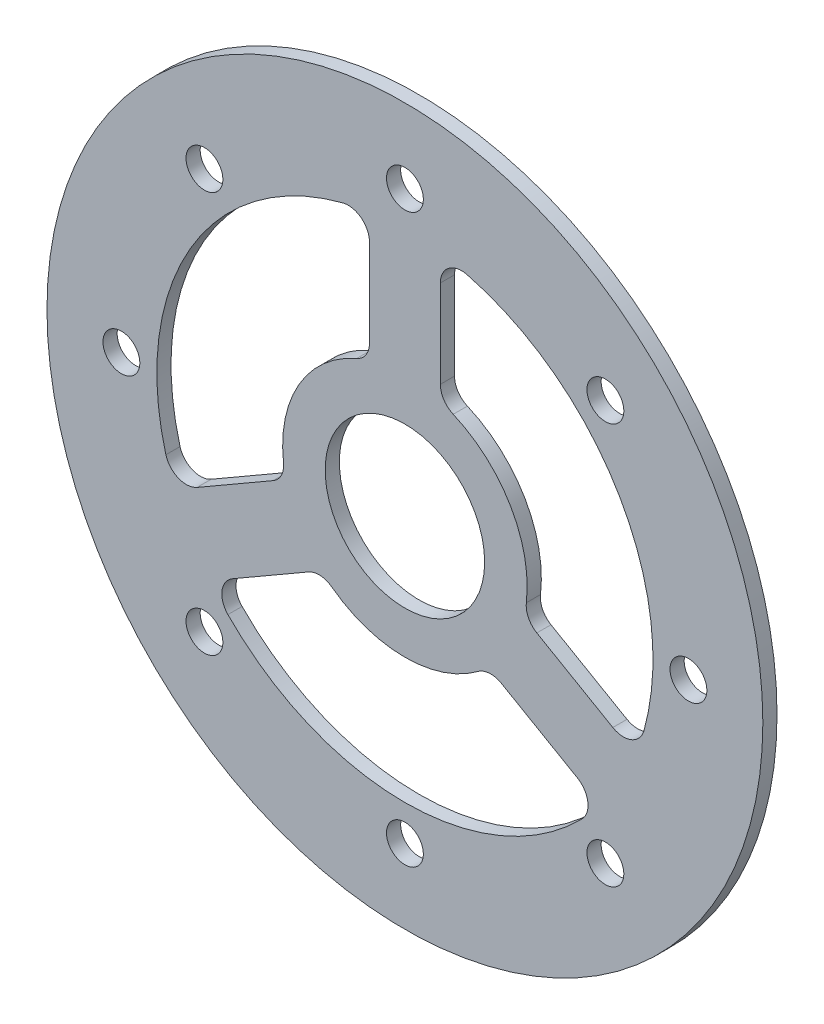
ISO-10303-21;
HEADER;
FILE_DESCRIPTION(('STEP AP214'),'2;1');
FILE_NAME('part.step','',(''),(''),'','','');
FILE_SCHEMA(('AUTOMOTIVE_DESIGN { 1 0 10303 214 1 1 1 1 }'));
ENDSEC;
DATA;
#1=APPLICATION_CONTEXT('core data for automotive mechanical design processes');
#2=APPLICATION_PROTOCOL_DEFINITION('international standard','automotive_design',2000,#1);
#3=PRODUCT_CONTEXT('',#1,'mechanical');
#4=PRODUCT('Part','Part','',(#3));
#5=PRODUCT_RELATED_PRODUCT_CATEGORY('part','',(#4));
#6=PRODUCT_DEFINITION_FORMATION('','',#4);
#7=PRODUCT_DEFINITION_CONTEXT('part definition',#1,'design');
#8=PRODUCT_DEFINITION('design','',#6,#7);
#9=PRODUCT_DEFINITION_SHAPE('','',#8);
#10=(LENGTH_UNIT() NAMED_UNIT(*) SI_UNIT(.MILLI.,.METRE.));
#11=(NAMED_UNIT(*) PLANE_ANGLE_UNIT() SI_UNIT($,.RADIAN.));
#12=(NAMED_UNIT(*) SI_UNIT($,.STERADIAN.) SOLID_ANGLE_UNIT());
#13=UNCERTAINTY_MEASURE_WITH_UNIT(LENGTH_MEASURE(1.E-05),#10,'distance_accuracy_value','');
#14=(GEOMETRIC_REPRESENTATION_CONTEXT(3) GLOBAL_UNCERTAINTY_ASSIGNED_CONTEXT((#13)) GLOBAL_UNIT_ASSIGNED_CONTEXT((#10,
#11,#12)) REPRESENTATION_CONTEXT('',''));
#15=CARTESIAN_POINT('',(0.,0.,0.));
#16=DIRECTION('',(0.,0.,1.));
#17=DIRECTION('',(1.,0.,0.));
#18=AXIS2_PLACEMENT_3D('',#15,#16,#17);
#19=CARTESIAN_POINT('',(0.,0.,2.));
#20=DIRECTION('',(0.,0.,-1.));
#21=DIRECTION('',(-1.,0.,0.));
#22=AXIS2_PLACEMENT_3D('',#19,#20,#21);
#23=CYLINDRICAL_SURFACE('',#22,35.);
#24=CARTESIAN_POINT('',(0.,0.,2.));
#25=DIRECTION('',(0.,0.,1.));
#26=DIRECTION('',(1.,0.,0.));
#27=AXIS2_PLACEMENT_3D('',#24,#25,#26);
#28=CIRCLE('',#27,35.);
#29=CARTESIAN_POINT('',(-8.75,33.8886042793149,2.));
#30=VERTEX_POINT('',#29);
#31=CARTESIAN_POINT('',(-33.7233922046847,-9.36657985654372,2.));
#32=VERTEX_POINT('',#31);
#33=EDGE_CURVE('E229',#30,#32,#28,.T.);
#34=ORIENTED_EDGE('',*,*,#33,.T.);
#35=DIRECTION('',(0.,0.,-1.));
#36=VECTOR('',#35,1.);
#37=CARTESIAN_POINT('',(-33.7233922046847,-9.36657985654372,2.));
#38=LINE('',#37,#36);
#39=CARTESIAN_POINT('',(-33.7233922046847,-9.36657985654372,0.));
#40=VERTEX_POINT('',#39);
#41=EDGE_CURVE('E52',#32,#40,#38,.T.);
#42=ORIENTED_EDGE('',*,*,#41,.T.);
#43=CARTESIAN_POINT('',(0.,0.,0.));
#44=DIRECTION('',(0.,0.,1.));
#45=DIRECTION('',(1.,0.,0.));
#46=AXIS2_PLACEMENT_3D('',#43,#44,#45);
#47=CIRCLE('',#46,35.);
#48=CARTESIAN_POINT('',(-8.75,33.8886042793149,0.));
#49=VERTEX_POINT('',#48);
#50=EDGE_CURVE('E227',#49,#40,#47,.T.);
#51=ORIENTED_EDGE('',*,*,#50,.F.);
#52=DIRECTION('',(0.,0.,-1.));
#53=VECTOR('',#52,1.);
#54=CARTESIAN_POINT('',(-8.75,33.8886042793149,2.));
#55=LINE('',#54,#53);
#56=EDGE_CURVE('E300',#49,#30,#55,.F.);
#57=ORIENTED_EDGE('',*,*,#56,.T.);
#58=EDGE_LOOP('',(#34,#42,#51,#57));
#59=FACE_BOUND('',#58,.T.);
#60=ADVANCED_FACE('F37',(#59),#23,.F.);
#61=CARTESIAN_POINT('',(-24.9733922046847,-24.5220244227713,2.));
#62=VERTEX_POINT('',#61);
#63=CARTESIAN_POINT('',(24.9733922046848,-24.5220244227713,2.));
#64=VERTEX_POINT('',#63);
#65=EDGE_CURVE('E226',#62,#64,#28,.T.);
#66=ORIENTED_EDGE('',*,*,#65,.T.);
#67=DIRECTION('',(0.,0.,-1.));
#68=VECTOR('',#67,1.);
#69=CARTESIAN_POINT('',(24.9733922046848,-24.5220244227713,2.));
#70=LINE('',#69,#68);
#71=CARTESIAN_POINT('',(24.9733922046848,-24.5220244227713,0.));
#72=VERTEX_POINT('',#71);
#73=EDGE_CURVE('E283',#64,#72,#70,.T.);
#74=ORIENTED_EDGE('',*,*,#73,.T.);
#75=CARTESIAN_POINT('',(-24.9733922046847,-24.5220244227713,0.));
#76=VERTEX_POINT('',#75);
#77=EDGE_CURVE('E231',#76,#72,#47,.T.);
#78=ORIENTED_EDGE('',*,*,#77,.F.);
#79=DIRECTION('',(0.,0.,-1.));
#80=VECTOR('',#79,1.);
#81=CARTESIAN_POINT('',(-24.9733922046847,-24.5220244227713,2.));
#82=LINE('',#81,#80);
#83=EDGE_CURVE('E280',#76,#62,#82,.F.);
#84=ORIENTED_EDGE('',*,*,#83,.T.);
#85=EDGE_LOOP('',(#66,#74,#78,#84));
#86=FACE_BOUND('',#85,.T.);
#87=ADVANCED_FACE('F368',(#86),#23,.F.);
#88=CARTESIAN_POINT('',(33.7233922046847,-9.36657985654361,0.));
#89=VERTEX_POINT('',#88);
#90=CARTESIAN_POINT('',(8.74999999999999,33.8886042793149,0.));
#91=VERTEX_POINT('',#90);
#92=EDGE_CURVE('E218',#89,#91,#47,.T.);
#93=ORIENTED_EDGE('',*,*,#92,.F.);
#94=DIRECTION('',(0.,0.,-1.));
#95=VECTOR('',#94,1.);
#96=CARTESIAN_POINT('',(33.7233922046847,-9.36657985654361,2.));
#97=LINE('',#96,#95);
#98=CARTESIAN_POINT('',(33.7233922046847,-9.36657985654361,2.));
#99=VERTEX_POINT('',#98);
#100=EDGE_CURVE('E203',#89,#99,#97,.F.);
#101=ORIENTED_EDGE('',*,*,#100,.T.);
#102=CARTESIAN_POINT('',(8.74999999999999,33.8886042793149,2.));
#103=VERTEX_POINT('',#102);
#104=EDGE_CURVE('E215',#99,#103,#28,.T.);
#105=ORIENTED_EDGE('',*,*,#104,.T.);
#106=DIRECTION('',(0.,0.,-1.));
#107=VECTOR('',#106,1.);
#108=CARTESIAN_POINT('',(8.74999999999999,33.8886042793149,2.));
#109=LINE('',#108,#107);
#110=EDGE_CURVE('E220',#103,#91,#109,.T.);
#111=ORIENTED_EDGE('',*,*,#110,.T.);
#112=EDGE_LOOP('',(#93,#101,#105,#111));
#113=FACE_BOUND('',#112,.T.);
#114=ADVANCED_FACE('F214',(#113),#23,.F.);
#115=CARTESIAN_POINT('',(0.,0.,2.));
#116=DIRECTION('',(0.,0.,1.));
#117=DIRECTION('',(1.,0.,0.));
#118=AXIS2_PLACEMENT_3D('',#115,#116,#117);
#119=PLANE('',#118);
#120=ORIENTED_EDGE('',*,*,#33,.F.);
#121=CARTESIAN_POINT('',(-8.,30.9838667696593,2.));
#122=DIRECTION('',(0.,0.,1.));
#123=DIRECTION('',(1.,0.,0.));
#124=AXIS2_PLACEMENT_3D('',#121,#122,#123);
#125=CIRCLE('',#124,3.);
#126=CARTESIAN_POINT('',(-5.,30.9838667696593,2.));
#127=VERTEX_POINT('',#126);
#128=EDGE_CURVE('E339',#30,#127,#125,.F.);
#129=ORIENTED_EDGE('',*,*,#128,.T.);
#130=DIRECTION('',(0.,-1.,0.));
#131=VECTOR('',#130,1.);
#132=CARTESIAN_POINT('',(-4.99999999999999,0.,2.));
#133=LINE('',#132,#131);
#134=CARTESIAN_POINT('',(-5.,18.6027551722856,2.));
#135=VERTEX_POINT('',#134);
#136=EDGE_CURVE('E438',#127,#135,#133,.T.);
#137=ORIENTED_EDGE('',*,*,#136,.T.);
#138=CARTESIAN_POINT('',(-8.,18.6027551722856,2.));
#139=DIRECTION('',(0.,0.,1.));
#140=DIRECTION('',(1.,0.,0.));
#141=AXIS2_PLACEMENT_3D('',#138,#139,#140);
#142=CIRCLE('',#141,3.);
#143=CARTESIAN_POINT('',(-6.81481481481481,15.8467914430581,2.));
#144=VERTEX_POINT('',#143);
#145=EDGE_CURVE('E327',#135,#144,#142,.F.);
#146=ORIENTED_EDGE('',*,*,#145,.T.);
#147=CARTESIAN_POINT('',(0.,0.,2.));
#148=DIRECTION('',(0.,0.,1.));
#149=DIRECTION('',(1.,0.,0.));
#150=AXIS2_PLACEMENT_3D('',#147,#148,#149);
#151=CIRCLE('',#150,17.25);
#152=CARTESIAN_POINT('',(-17.1311313655696,-2.02159296981291,2.));
#153=VERTEX_POINT('',#152);
#154=EDGE_CURVE('E435',#144,#153,#151,.T.);
#155=ORIENTED_EDGE('',*,*,#154,.T.);
#156=CARTESIAN_POINT('',(-20.1104585595817,-2.37317435586732,2.));
#157=DIRECTION('',(0.,0.,1.));
#158=DIRECTION('',(1.,0.,0.));
#159=AXIS2_PLACEMENT_3D('',#156,#157,#158);
#160=CIRCLE('',#159,3.);
#161=CARTESIAN_POINT('',(-18.6104585595817,-4.97125056722064,2.));
#162=VERTEX_POINT('',#161);
#163=EDGE_CURVE('E331',#153,#162,#160,.F.);
#164=ORIENTED_EDGE('',*,*,#163,.T.);
#165=DIRECTION('',(0.866025403784435,0.500000000000006,0.));
#166=VECTOR('',#165,1.);
#167=CARTESIAN_POINT('',(-2.50000000000008,4.33012701892227,2.));
#168=LINE('',#167,#166);
#169=CARTESIAN_POINT('',(-29.3328157299975,-11.1618063659076,2.));
#170=VERTEX_POINT('',#169);
#171=EDGE_CURVE('E356',#170,#162,#168,.T.);
#172=ORIENTED_EDGE('',*,*,#171,.F.);
#173=CARTESIAN_POINT('',(-30.8328157299975,-8.56373015455426,2.));
#174=DIRECTION('',(0.,0.,1.));
#175=DIRECTION('',(1.,0.,0.));
#176=AXIS2_PLACEMENT_3D('',#173,#174,#175);
#177=CIRCLE('',#176,3.);
#178=EDGE_CURVE('E335',#170,#32,#177,.F.);
#179=ORIENTED_EDGE('',*,*,#178,.T.);
#180=EDGE_LOOP('',(#120,#129,#137,#146,#155,#164,#172,#179));
#181=FACE_BOUND('',#180,.T.);
#182=DIRECTION('',(0.,-1.,0.));
#183=VECTOR('',#182,1.);
#184=CARTESIAN_POINT('',(5.00000000000002,0.,2.));
#185=LINE('',#184,#183);
#186=CARTESIAN_POINT('',(4.99999999999999,30.9838667696593,2.));
#187=VERTEX_POINT('',#186);
#188=CARTESIAN_POINT('',(5.,18.6027551722856,2.));
#189=VERTEX_POINT('',#188);
#190=EDGE_CURVE('E424',#187,#189,#185,.T.);
#191=ORIENTED_EDGE('',*,*,#190,.F.);
#192=CARTESIAN_POINT('',(7.99999999999999,30.9838667696593,2.));
#193=DIRECTION('',(0.,0.,1.));
#194=DIRECTION('',(1.,0.,0.));
#195=AXIS2_PLACEMENT_3D('',#192,#193,#194);
#196=CIRCLE('',#195,3.);
#197=EDGE_CURVE('E225',#187,#103,#196,.F.);
#198=ORIENTED_EDGE('',*,*,#197,.T.);
#199=ORIENTED_EDGE('',*,*,#104,.F.);
#200=CARTESIAN_POINT('',(30.8328157299975,-8.56373015455415,2.));
#201=DIRECTION('',(0.,0.,1.));
#202=DIRECTION('',(1.,0.,0.));
#203=AXIS2_PLACEMENT_3D('',#200,#201,#202);
#204=CIRCLE('',#203,3.);
#205=CARTESIAN_POINT('',(29.3328157299975,-11.1618063659075,2.));
#206=VERTEX_POINT('',#205);
#207=EDGE_CURVE('E199',#99,#206,#204,.F.);
#208=ORIENTED_EDGE('',*,*,#207,.T.);
#209=DIRECTION('',(-0.866025403784439,0.5,0.));
#210=VECTOR('',#209,1.);
#211=CARTESIAN_POINT('',(2.5,4.33012701892219,2.));
#212=LINE('',#211,#210);
#213=CARTESIAN_POINT('',(18.6104585595817,-4.97125056722062,2.));
#214=VERTEX_POINT('',#213);
#215=EDGE_CURVE('E428',#206,#214,#212,.T.);
#216=ORIENTED_EDGE('',*,*,#215,.T.);
#217=CARTESIAN_POINT('',(20.1104585595817,-2.3731743558673,2.));
#218=DIRECTION('',(0.,0.,1.));
#219=DIRECTION('',(1.,0.,0.));
#220=AXIS2_PLACEMENT_3D('',#217,#218,#219);
#221=CIRCLE('',#220,3.);
#222=CARTESIAN_POINT('',(17.1311313655696,-2.02159296981289,2.));
#223=VERTEX_POINT('',#222);
#224=EDGE_CURVE('E304',#214,#223,#221,.F.);
#225=ORIENTED_EDGE('',*,*,#224,.T.);
#226=CARTESIAN_POINT('',(6.81481481481481,15.8467914430581,2.));
#227=VERTEX_POINT('',#226);
#228=EDGE_CURVE('E427',#223,#227,#151,.T.);
#229=ORIENTED_EDGE('',*,*,#228,.T.);
#230=CARTESIAN_POINT('',(8.,18.6027551722856,2.));
#231=DIRECTION('',(0.,0.,1.));
#232=DIRECTION('',(1.,0.,0.));
#233=AXIS2_PLACEMENT_3D('',#230,#231,#232);
#234=CIRCLE('',#233,3.);
#235=EDGE_CURVE('E308',#227,#189,#234,.F.);
#236=ORIENTED_EDGE('',*,*,#235,.T.);
#237=EDGE_LOOP('',(#191,#198,#199,#208,#216,#225,#229,#236));
#238=FACE_BOUND('',#237,.T.);
#239=CARTESIAN_POINT('',(-40.,0.,2.));
#240=DIRECTION('',(0.,0.,1.));
#241=DIRECTION('',(1.,0.,0.));
#242=AXIS2_PLACEMENT_3D('',#239,#240,#241);
#243=CIRCLE('',#242,2.59999999999999);
#244=CARTESIAN_POINT('',(-37.4,0.,2.));
#245=VERTEX_POINT('',#244);
#246=EDGE_CURVE('E402',#245,#245,#243,.T.);
#247=ORIENTED_EDGE('',*,*,#246,.F.);
#248=EDGE_LOOP('',(#247));
#249=FACE_BOUND('',#248,.T.);
#250=CARTESIAN_POINT('',(0.,-40.,2.));
#251=DIRECTION('',(0.,0.,1.));
#252=DIRECTION('',(1.,0.,0.));
#253=AXIS2_PLACEMENT_3D('',#250,#251,#252);
#254=CIRCLE('',#253,2.59999999999999);
#255=CARTESIAN_POINT('',(2.6,-40.,2.));
#256=VERTEX_POINT('',#255);
#257=EDGE_CURVE('E390',#256,#256,#254,.T.);
#258=ORIENTED_EDGE('',*,*,#257,.F.);
#259=EDGE_LOOP('',(#258));
#260=FACE_BOUND('',#259,.T.);
#261=CARTESIAN_POINT('',(40.,0.,2.));
#262=DIRECTION('',(0.,0.,1.));
#263=DIRECTION('',(1.,0.,0.));
#264=AXIS2_PLACEMENT_3D('',#261,#262,#263);
#265=CIRCLE('',#264,2.59999999999999);
#266=CARTESIAN_POINT('',(42.6,0.,2.));
#267=VERTEX_POINT('',#266);
#268=EDGE_CURVE('E379',#267,#267,#265,.T.);
#269=ORIENTED_EDGE('',*,*,#268,.F.);
#270=EDGE_LOOP('',(#269));
#271=FACE_BOUND('',#270,.T.);
#272=ORIENTED_EDGE('',*,*,#65,.F.);
#273=CARTESIAN_POINT('',(-22.8328157299975,-22.4201366151052,2.));
#274=DIRECTION('',(0.,0.,1.));
#275=DIRECTION('',(1.,0.,0.));
#276=AXIS2_PLACEMENT_3D('',#273,#274,#275);
#277=CIRCLE('',#276,3.);
#278=CARTESIAN_POINT('',(-24.3328157299975,-19.8220604037519,2.));
#279=VERTEX_POINT('',#278);
#280=EDGE_CURVE('E45',#62,#279,#277,.F.);
#281=ORIENTED_EDGE('',*,*,#280,.T.);
#282=DIRECTION('',(0.866025403784438,0.500000000000001,0.));
#283=VECTOR('',#282,1.);
#284=CARTESIAN_POINT('',(2.5,-4.33012701892219,2.));
#285=LINE('',#284,#283);
#286=CARTESIAN_POINT('',(-13.6104585595817,-13.631504605065,2.));
#287=VERTEX_POINT('',#286);
#288=EDGE_CURVE('E346',#279,#287,#285,.T.);
#289=ORIENTED_EDGE('',*,*,#288,.T.);
#290=CARTESIAN_POINT('',(-12.1104585595817,-16.2295808164183,2.));
#291=DIRECTION('',(0.,0.,1.));
#292=DIRECTION('',(1.,0.,0.));
#293=AXIS2_PLACEMENT_3D('',#290,#291,#292);
#294=CIRCLE('',#293,3.);
#295=CARTESIAN_POINT('',(-10.3163165507548,-13.8251984732452,2.));
#296=VERTEX_POINT('',#295);
#297=EDGE_CURVE('E315',#287,#296,#294,.F.);
#298=ORIENTED_EDGE('',*,*,#297,.T.);
#299=CARTESIAN_POINT('',(10.3163165507548,-13.8251984732452,2.));
#300=VERTEX_POINT('',#299);
#301=EDGE_CURVE('E355',#296,#300,#151,.T.);
#302=ORIENTED_EDGE('',*,*,#301,.T.);
#303=CARTESIAN_POINT('',(12.1104585595817,-16.2295808164183,2.));
#304=DIRECTION('',(0.,0.,1.));
#305=DIRECTION('',(1.,0.,0.));
#306=AXIS2_PLACEMENT_3D('',#303,#304,#305);
#307=CIRCLE('',#306,3.);
#308=CARTESIAN_POINT('',(13.6104585595817,-13.631504605065,2.));
#309=VERTEX_POINT('',#308);
#310=EDGE_CURVE('E319',#300,#309,#307,.F.);
#311=ORIENTED_EDGE('',*,*,#310,.T.);
#312=DIRECTION('',(-0.86602540378444,0.499999999999998,0.));
#313=VECTOR('',#312,1.);
#314=CARTESIAN_POINT('',(-2.50000000000001,-4.33012701892224,2.));
#315=LINE('',#314,#313);
#316=CARTESIAN_POINT('',(24.3328157299975,-19.8220604037518,2.));
#317=VERTEX_POINT('',#316);
#318=EDGE_CURVE('E430',#317,#309,#315,.T.);
#319=ORIENTED_EDGE('',*,*,#318,.F.);
#320=CARTESIAN_POINT('',(22.8328157299975,-22.4201366151051,2.));
#321=DIRECTION('',(0.,0.,1.));
#322=DIRECTION('',(1.,0.,0.));
#323=AXIS2_PLACEMENT_3D('',#320,#321,#322);
#324=CIRCLE('',#323,3.);
#325=EDGE_CURVE('E323',#317,#64,#324,.F.);
#326=ORIENTED_EDGE('',*,*,#325,.T.);
#327=EDGE_LOOP('',(#272,#281,#289,#298,#302,#311,#319,#326));
#328=FACE_BOUND('',#327,.T.);
#329=CARTESIAN_POINT('',(0.,0.,2.));
#330=DIRECTION('',(0.,0.,1.));
#331=DIRECTION('',(1.,0.,0.));
#332=AXIS2_PLACEMENT_3D('',#329,#330,#331);
#333=CIRCLE('',#332,50.5);
#334=CARTESIAN_POINT('',(50.5,0.,2.));
#335=VERTEX_POINT('',#334);
#336=EDGE_CURVE('E246',#335,#335,#333,.T.);
#337=ORIENTED_EDGE('',*,*,#336,.T.);
#338=EDGE_LOOP('',(#337));
#339=FACE_BOUND('',#338,.T.);
#340=CARTESIAN_POINT('',(0.,40.,2.));
#341=DIRECTION('',(0.,0.,1.));
#342=DIRECTION('',(1.,0.,0.));
#343=AXIS2_PLACEMENT_3D('',#340,#341,#342);
#344=CIRCLE('',#343,2.59999999999999);
#345=CARTESIAN_POINT('',(2.59999999999999,40.,2.));
#346=VERTEX_POINT('',#345);
#347=EDGE_CURVE('E238',#346,#346,#344,.T.);
#348=ORIENTED_EDGE('',*,*,#347,.F.);
#349=EDGE_LOOP('',(#348));
#350=FACE_BOUND('',#349,.T.);
#351=CARTESIAN_POINT('',(28.2842712474619,28.2842712474619,2.));
#352=DIRECTION('',(0.,0.,1.));
#353=DIRECTION('',(1.,0.,0.));
#354=AXIS2_PLACEMENT_3D('',#351,#352,#353);
#355=CIRCLE('',#354,2.59999999999999);
#356=CARTESIAN_POINT('',(30.8842712474619,28.2842712474619,2.));
#357=VERTEX_POINT('',#356);
#358=EDGE_CURVE('E370',#357,#357,#355,.T.);
#359=ORIENTED_EDGE('',*,*,#358,.F.);
#360=EDGE_LOOP('',(#359));
#361=FACE_BOUND('',#360,.T.);
#362=CARTESIAN_POINT('',(28.2842712474619,-28.2842712474619,2.));
#363=DIRECTION('',(0.,0.,1.));
#364=DIRECTION('',(1.,0.,0.));
#365=AXIS2_PLACEMENT_3D('',#362,#363,#364);
#366=CIRCLE('',#365,2.59999999999999);
#367=CARTESIAN_POINT('',(30.8842712474619,-28.2842712474619,2.));
#368=VERTEX_POINT('',#367);
#369=EDGE_CURVE('E384',#368,#368,#366,.T.);
#370=ORIENTED_EDGE('',*,*,#369,.F.);
#371=EDGE_LOOP('',(#370));
#372=FACE_BOUND('',#371,.T.);
#373=CARTESIAN_POINT('',(-28.2842712474619,-28.2842712474619,2.));
#374=DIRECTION('',(0.,0.,1.));
#375=DIRECTION('',(1.,0.,0.));
#376=AXIS2_PLACEMENT_3D('',#373,#374,#375);
#377=CIRCLE('',#376,2.59999999999999);
#378=CARTESIAN_POINT('',(-25.6842712474619,-28.2842712474619,2.));
#379=VERTEX_POINT('',#378);
#380=EDGE_CURVE('E396',#379,#379,#377,.T.);
#381=ORIENTED_EDGE('',*,*,#380,.F.);
#382=EDGE_LOOP('',(#381));
#383=FACE_BOUND('',#382,.T.);
#384=CARTESIAN_POINT('',(-28.2842712474619,28.2842712474619,2.));
#385=DIRECTION('',(0.,0.,1.));
#386=DIRECTION('',(1.,0.,0.));
#387=AXIS2_PLACEMENT_3D('',#384,#385,#386);
#388=CIRCLE('',#387,2.59999999999999);
#389=CARTESIAN_POINT('',(-25.6842712474619,28.2842712474619,2.));
#390=VERTEX_POINT('',#389);
#391=EDGE_CURVE('E408',#390,#390,#388,.T.);
#392=ORIENTED_EDGE('',*,*,#391,.F.);
#393=EDGE_LOOP('',(#392));
#394=FACE_BOUND('',#393,.T.);
#395=CARTESIAN_POINT('',(0.,0.,2.));
#396=DIRECTION('',(0.,0.,1.));
#397=DIRECTION('',(1.,0.,0.));
#398=AXIS2_PLACEMENT_3D('',#395,#396,#397);
#399=CIRCLE('',#398,11.25);
#400=CARTESIAN_POINT('',(11.25,0.,2.));
#401=VERTEX_POINT('',#400);
#402=EDGE_CURVE('E420',#401,#401,#399,.T.);
#403=ORIENTED_EDGE('',*,*,#402,.F.);
#404=EDGE_LOOP('',(#403));
#405=FACE_BOUND('',#404,.T.);
#406=ADVANCED_FACE('F223',(#181,#238,#249,#260,#271,#328,#339,#350,#361,#372,#383,#394,#405),
#119,.T.);
#407=CARTESIAN_POINT('',(0.,0.,0.));
#408=DIRECTION('',(0.,0.,1.));
#409=DIRECTION('',(1.,0.,0.));
#410=AXIS2_PLACEMENT_3D('',#407,#408,#409);
#411=PLANE('',#410);
#412=CARTESIAN_POINT('',(0.,0.,0.));
#413=DIRECTION('',(0.,0.,1.));
#414=DIRECTION('',(1.,0.,0.));
#415=AXIS2_PLACEMENT_3D('',#412,#413,#414);
#416=CIRCLE('',#415,17.25);
#417=CARTESIAN_POINT('',(-17.1311313655696,-2.02159296981291,0.));
#418=VERTEX_POINT('',#417);
#419=CARTESIAN_POINT('',(-6.81481481481481,15.8467914430581,0.));
#420=VERTEX_POINT('',#419);
#421=EDGE_CURVE('E419',#418,#420,#416,.F.);
#422=ORIENTED_EDGE('',*,*,#421,.T.);
#423=CARTESIAN_POINT('',(-8.,18.6027551722856,0.));
#424=DIRECTION('',(0.,0.,1.));
#425=DIRECTION('',(1.,0.,0.));
#426=AXIS2_PLACEMENT_3D('',#423,#424,#425);
#427=CIRCLE('',#426,3.);
#428=CARTESIAN_POINT('',(-5.,18.6027551722856,0.));
#429=VERTEX_POINT('',#428);
#430=EDGE_CURVE('E329',#420,#429,#427,.T.);
#431=ORIENTED_EDGE('',*,*,#430,.T.);
#432=DIRECTION('',(0.,1.,0.));
#433=VECTOR('',#432,1.);
#434=CARTESIAN_POINT('',(-4.99999999999999,0.,0.));
#435=LINE('',#434,#433);
#436=CARTESIAN_POINT('',(-5.,30.9838667696593,0.));
#437=VERTEX_POINT('',#436);
#438=EDGE_CURVE('E441',#429,#437,#435,.T.);
#439=ORIENTED_EDGE('',*,*,#438,.T.);
#440=CARTESIAN_POINT('',(-8.,30.9838667696593,0.));
#441=DIRECTION('',(0.,0.,1.));
#442=DIRECTION('',(1.,0.,0.));
#443=AXIS2_PLACEMENT_3D('',#440,#441,#442);
#444=CIRCLE('',#443,3.);
#445=EDGE_CURVE('E59',#437,#49,#444,.T.);
#446=ORIENTED_EDGE('',*,*,#445,.T.);
#447=ORIENTED_EDGE('',*,*,#50,.T.);
#448=CARTESIAN_POINT('',(-30.8328157299975,-8.56373015455426,0.));
#449=DIRECTION('',(0.,0.,1.));
#450=DIRECTION('',(1.,0.,0.));
#451=AXIS2_PLACEMENT_3D('',#448,#449,#450);
#452=CIRCLE('',#451,3.);
#453=CARTESIAN_POINT('',(-29.3328157299974,-11.1618063659076,0.));
#454=VERTEX_POINT('',#453);
#455=EDGE_CURVE('E337',#40,#454,#452,.T.);
#456=ORIENTED_EDGE('',*,*,#455,.T.);
#457=DIRECTION('',(-0.866025403784435,-0.500000000000006,0.));
#458=VECTOR('',#457,1.);
#459=CARTESIAN_POINT('',(-2.50000000000008,4.33012701892227,0.));
#460=LINE('',#459,#458);
#461=CARTESIAN_POINT('',(-18.6104585595817,-4.97125056722063,0.));
#462=VERTEX_POINT('',#461);
#463=EDGE_CURVE('E423',#462,#454,#460,.T.);
#464=ORIENTED_EDGE('',*,*,#463,.F.);
#465=CARTESIAN_POINT('',(-20.1104585595817,-2.37317435586732,0.));
#466=DIRECTION('',(0.,0.,1.));
#467=DIRECTION('',(1.,0.,0.));
#468=AXIS2_PLACEMENT_3D('',#465,#466,#467);
#469=CIRCLE('',#468,3.);
#470=EDGE_CURVE('E333',#462,#418,#469,.T.);
#471=ORIENTED_EDGE('',*,*,#470,.T.);
#472=EDGE_LOOP('',(#422,#431,#439,#446,#447,#456,#464,#471));
#473=FACE_BOUND('',#472,.T.);
#474=CARTESIAN_POINT('',(0.,0.,0.));
#475=DIRECTION('',(0.,0.,1.));
#476=DIRECTION('',(1.,0.,0.));
#477=AXIS2_PLACEMENT_3D('',#474,#475,#476);
#478=CIRCLE('',#477,17.25);
#479=CARTESIAN_POINT('',(10.3163165507548,-13.8251984732452,0.));
#480=VERTEX_POINT('',#479);
#481=CARTESIAN_POINT('',(-10.3163165507548,-13.8251984732452,0.));
#482=VERTEX_POINT('',#481);
#483=EDGE_CURVE('E455',#480,#482,#478,.F.);
#484=ORIENTED_EDGE('',*,*,#483,.T.);
#485=CARTESIAN_POINT('',(-12.1104585595817,-16.2295808164183,0.));
#486=DIRECTION('',(0.,0.,1.));
#487=DIRECTION('',(1.,0.,0.));
#488=AXIS2_PLACEMENT_3D('',#485,#486,#487);
#489=CIRCLE('',#488,3.);
#490=CARTESIAN_POINT('',(-13.6104585595817,-13.631504605065,0.));
#491=VERTEX_POINT('',#490);
#492=EDGE_CURVE('E317',#482,#491,#489,.T.);
#493=ORIENTED_EDGE('',*,*,#492,.T.);
#494=DIRECTION('',(-0.866025403784438,-0.500000000000001,0.));
#495=VECTOR('',#494,1.);
#496=CARTESIAN_POINT('',(2.5,-4.33012701892219,0.));
#497=LINE('',#496,#495);
#498=CARTESIAN_POINT('',(-24.3328157299975,-19.8220604037519,0.));
#499=VERTEX_POINT('',#498);
#500=EDGE_CURVE('E366',#491,#499,#497,.T.);
#501=ORIENTED_EDGE('',*,*,#500,.T.);
#502=CARTESIAN_POINT('',(-22.8328157299975,-22.4201366151052,0.));
#503=DIRECTION('',(0.,0.,1.));
#504=DIRECTION('',(1.,0.,0.));
#505=AXIS2_PLACEMENT_3D('',#502,#503,#504);
#506=CIRCLE('',#505,3.);
#507=EDGE_CURVE('E11',#499,#76,#506,.T.);
#508=ORIENTED_EDGE('',*,*,#507,.T.);
#509=ORIENTED_EDGE('',*,*,#77,.T.);
#510=CARTESIAN_POINT('',(22.8328157299975,-22.4201366151051,0.));
#511=DIRECTION('',(0.,0.,1.));
#512=DIRECTION('',(1.,0.,0.));
#513=AXIS2_PLACEMENT_3D('',#510,#511,#512);
#514=CIRCLE('',#513,3.);
#515=CARTESIAN_POINT('',(24.3328157299975,-19.8220604037518,0.));
#516=VERTEX_POINT('',#515);
#517=EDGE_CURVE('E325',#72,#516,#514,.T.);
#518=ORIENTED_EDGE('',*,*,#517,.T.);
#519=DIRECTION('',(0.86602540378444,-0.499999999999998,0.));
#520=VECTOR('',#519,1.);
#521=CARTESIAN_POINT('',(-2.50000000000001,-4.33012701892224,0.));
#522=LINE('',#521,#520);
#523=CARTESIAN_POINT('',(13.6104585595817,-13.631504605065,0.));
#524=VERTEX_POINT('',#523);
#525=EDGE_CURVE('E452',#524,#516,#522,.T.);
#526=ORIENTED_EDGE('',*,*,#525,.F.);
#527=CARTESIAN_POINT('',(12.1104585595817,-16.2295808164183,0.));
#528=DIRECTION('',(0.,0.,1.));
#529=DIRECTION('',(1.,0.,0.));
#530=AXIS2_PLACEMENT_3D('',#527,#528,#529);
#531=CIRCLE('',#530,3.);
#532=EDGE_CURVE('E321',#524,#480,#531,.T.);
#533=ORIENTED_EDGE('',*,*,#532,.T.);
#534=EDGE_LOOP('',(#484,#493,#501,#508,#509,#518,#526,#533));
#535=FACE_BOUND('',#534,.T.);
#536=CARTESIAN_POINT('',(0.,0.,0.));
#537=DIRECTION('',(0.,0.,1.));
#538=DIRECTION('',(1.,0.,0.));
#539=AXIS2_PLACEMENT_3D('',#536,#537,#538);
#540=CIRCLE('',#539,50.5);
#541=CARTESIAN_POINT('',(50.5,0.,0.));
#542=VERTEX_POINT('',#541);
#543=EDGE_CURVE('E243',#542,#542,#540,.T.);
#544=ORIENTED_EDGE('',*,*,#543,.F.);
#545=EDGE_LOOP('',(#544));
#546=FACE_BOUND('',#545,.T.);
#547=CARTESIAN_POINT('',(0.,40.,0.));
#548=DIRECTION('',(0.,0.,1.));
#549=DIRECTION('',(1.,0.,0.));
#550=AXIS2_PLACEMENT_3D('',#547,#548,#549);
#551=CIRCLE('',#550,2.59999999999999);
#552=CARTESIAN_POINT('',(2.59999999999999,40.,0.));
#553=VERTEX_POINT('',#552);
#554=EDGE_CURVE('E234',#553,#553,#551,.T.);
#555=ORIENTED_EDGE('',*,*,#554,.T.);
#556=EDGE_LOOP('',(#555));
#557=FACE_BOUND('',#556,.T.);
#558=DIRECTION('',(0.866025403784439,-0.5,0.));
#559=VECTOR('',#558,1.);
#560=CARTESIAN_POINT('',(2.5,4.33012701892219,0.));
#561=LINE('',#560,#559);
#562=CARTESIAN_POINT('',(18.6104585595817,-4.97125056722062,0.));
#563=VERTEX_POINT('',#562);
#564=CARTESIAN_POINT('',(29.3328157299975,-11.1618063659075,0.));
#565=VERTEX_POINT('',#564);
#566=EDGE_CURVE('E449',#563,#565,#561,.T.);
#567=ORIENTED_EDGE('',*,*,#566,.T.);
#568=CARTESIAN_POINT('',(30.8328157299975,-8.56373015455415,0.));
#569=DIRECTION('',(0.,0.,1.));
#570=DIRECTION('',(1.,0.,0.));
#571=AXIS2_PLACEMENT_3D('',#568,#569,#570);
#572=CIRCLE('',#571,3.);
#573=EDGE_CURVE('E209',#565,#89,#572,.T.);
#574=ORIENTED_EDGE('',*,*,#573,.T.);
#575=ORIENTED_EDGE('',*,*,#92,.T.);
#576=CARTESIAN_POINT('',(7.99999999999999,30.9838667696593,0.));
#577=DIRECTION('',(0.,0.,1.));
#578=DIRECTION('',(1.,0.,0.));
#579=AXIS2_PLACEMENT_3D('',#576,#577,#578);
#580=CIRCLE('',#579,3.);
#581=CARTESIAN_POINT('',(4.99999999999999,30.9838667696593,0.));
#582=VERTEX_POINT('',#581);
#583=EDGE_CURVE('E313',#91,#582,#580,.T.);
#584=ORIENTED_EDGE('',*,*,#583,.T.);
#585=DIRECTION('',(0.,1.,0.));
#586=VECTOR('',#585,1.);
#587=CARTESIAN_POINT('',(5.00000000000002,0.,0.));
#588=LINE('',#587,#586);
#589=CARTESIAN_POINT('',(5.,18.6027551722856,0.));
#590=VERTEX_POINT('',#589);
#591=EDGE_CURVE('E443',#590,#582,#588,.T.);
#592=ORIENTED_EDGE('',*,*,#591,.F.);
#593=CARTESIAN_POINT('',(8.,18.6027551722856,0.));
#594=DIRECTION('',(0.,0.,1.));
#595=DIRECTION('',(1.,0.,0.));
#596=AXIS2_PLACEMENT_3D('',#593,#594,#595);
#597=CIRCLE('',#596,3.);
#598=CARTESIAN_POINT('',(6.81481481481481,15.8467914430581,0.));
#599=VERTEX_POINT('',#598);
#600=EDGE_CURVE('E310',#590,#599,#597,.T.);
#601=ORIENTED_EDGE('',*,*,#600,.T.);
#602=CARTESIAN_POINT('',(0.,0.,0.));
#603=DIRECTION('',(0.,0.,1.));
#604=DIRECTION('',(1.,0.,0.));
#605=AXIS2_PLACEMENT_3D('',#602,#603,#604);
#606=CIRCLE('',#605,17.25);
#607=CARTESIAN_POINT('',(17.1311313655696,-2.02159296981289,0.));
#608=VERTEX_POINT('',#607);
#609=EDGE_CURVE('E446',#599,#608,#606,.F.);
#610=ORIENTED_EDGE('',*,*,#609,.T.);
#611=CARTESIAN_POINT('',(20.1104585595817,-2.3731743558673,0.));
#612=DIRECTION('',(0.,0.,1.));
#613=DIRECTION('',(1.,0.,0.));
#614=AXIS2_PLACEMENT_3D('',#611,#612,#613);
#615=CIRCLE('',#614,3.);
#616=EDGE_CURVE('E306',#608,#563,#615,.T.);
#617=ORIENTED_EDGE('',*,*,#616,.T.);
#618=EDGE_LOOP('',(#567,#574,#575,#584,#592,#601,#610,#617));
#619=FACE_BOUND('',#618,.T.);
#620=CARTESIAN_POINT('',(28.2842712474619,28.2842712474619,0.));
#621=DIRECTION('',(0.,0.,1.));
#622=DIRECTION('',(1.,0.,0.));
#623=AXIS2_PLACEMENT_3D('',#620,#621,#622);
#624=CIRCLE('',#623,2.59999999999999);
#625=CARTESIAN_POINT('',(30.8842712474619,28.2842712474619,0.));
#626=VERTEX_POINT('',#625);
#627=EDGE_CURVE('E374',#626,#626,#624,.T.);
#628=ORIENTED_EDGE('',*,*,#627,.T.);
#629=EDGE_LOOP('',(#628));
#630=FACE_BOUND('',#629,.T.);
#631=CARTESIAN_POINT('',(40.,0.,0.));
#632=DIRECTION('',(0.,0.,1.));
#633=DIRECTION('',(1.,0.,0.));
#634=AXIS2_PLACEMENT_3D('',#631,#632,#633);
#635=CIRCLE('',#634,2.59999999999999);
#636=CARTESIAN_POINT('',(42.6,0.,0.));
#637=VERTEX_POINT('',#636);
#638=EDGE_CURVE('E381',#637,#637,#635,.T.);
#639=ORIENTED_EDGE('',*,*,#638,.T.);
#640=EDGE_LOOP('',(#639));
#641=FACE_BOUND('',#640,.T.);
#642=CARTESIAN_POINT('',(28.2842712474619,-28.2842712474619,0.));
#643=DIRECTION('',(0.,0.,1.));
#644=DIRECTION('',(1.,0.,0.));
#645=AXIS2_PLACEMENT_3D('',#642,#643,#644);
#646=CIRCLE('',#645,2.59999999999999);
#647=CARTESIAN_POINT('',(30.8842712474619,-28.2842712474619,0.));
#648=VERTEX_POINT('',#647);
#649=EDGE_CURVE('E387',#648,#648,#646,.T.);
#650=ORIENTED_EDGE('',*,*,#649,.T.);
#651=EDGE_LOOP('',(#650));
#652=FACE_BOUND('',#651,.T.);
#653=CARTESIAN_POINT('',(0.,-40.,0.));
#654=DIRECTION('',(0.,0.,1.));
#655=DIRECTION('',(1.,0.,0.));
#656=AXIS2_PLACEMENT_3D('',#653,#654,#655);
#657=CIRCLE('',#656,2.59999999999999);
#658=CARTESIAN_POINT('',(2.6,-40.,0.));
#659=VERTEX_POINT('',#658);
#660=EDGE_CURVE('E393',#659,#659,#657,.T.);
#661=ORIENTED_EDGE('',*,*,#660,.T.);
#662=EDGE_LOOP('',(#661));
#663=FACE_BOUND('',#662,.T.);
#664=CARTESIAN_POINT('',(-28.2842712474619,-28.2842712474619,0.));
#665=DIRECTION('',(0.,0.,1.));
#666=DIRECTION('',(1.,0.,0.));
#667=AXIS2_PLACEMENT_3D('',#664,#665,#666);
#668=CIRCLE('',#667,2.59999999999999);
#669=CARTESIAN_POINT('',(-25.6842712474619,-28.2842712474619,0.));
#670=VERTEX_POINT('',#669);
#671=EDGE_CURVE('E399',#670,#670,#668,.T.);
#672=ORIENTED_EDGE('',*,*,#671,.T.);
#673=EDGE_LOOP('',(#672));
#674=FACE_BOUND('',#673,.T.);
#675=CARTESIAN_POINT('',(-40.,0.,0.));
#676=DIRECTION('',(0.,0.,1.));
#677=DIRECTION('',(1.,0.,0.));
#678=AXIS2_PLACEMENT_3D('',#675,#676,#677);
#679=CIRCLE('',#678,2.59999999999999);
#680=CARTESIAN_POINT('',(-37.4,0.,0.));
#681=VERTEX_POINT('',#680);
#682=EDGE_CURVE('E405',#681,#681,#679,.T.);
#683=ORIENTED_EDGE('',*,*,#682,.T.);
#684=EDGE_LOOP('',(#683));
#685=FACE_BOUND('',#684,.T.);
#686=CARTESIAN_POINT('',(-28.2842712474619,28.2842712474619,0.));
#687=DIRECTION('',(0.,0.,1.));
#688=DIRECTION('',(1.,0.,0.));
#689=AXIS2_PLACEMENT_3D('',#686,#687,#688);
#690=CIRCLE('',#689,2.59999999999999);
#691=CARTESIAN_POINT('',(-25.6842712474619,28.2842712474619,0.));
#692=VERTEX_POINT('',#691);
#693=EDGE_CURVE('E411',#692,#692,#690,.T.);
#694=ORIENTED_EDGE('',*,*,#693,.T.);
#695=EDGE_LOOP('',(#694));
#696=FACE_BOUND('',#695,.T.);
#697=CARTESIAN_POINT('',(0.,0.,0.));
#698=DIRECTION('',(0.,0.,1.));
#699=DIRECTION('',(1.,0.,0.));
#700=AXIS2_PLACEMENT_3D('',#697,#698,#699);
#701=CIRCLE('',#700,11.25);
#702=CARTESIAN_POINT('',(11.25,0.,0.));
#703=VERTEX_POINT('',#702);
#704=EDGE_CURVE('E414',#703,#703,#701,.F.);
#705=ORIENTED_EDGE('',*,*,#704,.F.);
#706=EDGE_LOOP('',(#705));
#707=FACE_BOUND('',#706,.T.);
#708=ADVANCED_FACE('F363',(#473,#535,#546,#557,#619,#630,#641,#652,#663,#674,#685,#696,#707),
#411,.F.);
#709=CARTESIAN_POINT('',(0.,0.,2.));
#710=DIRECTION('',(0.,0.,-1.));
#711=DIRECTION('',(-1.,0.,0.));
#712=AXIS2_PLACEMENT_3D('',#709,#710,#711);
#713=CYLINDRICAL_SURFACE('',#712,50.5);
#714=ORIENTED_EDGE('',*,*,#336,.F.);
#715=EDGE_LOOP('',(#714));
#716=FACE_BOUND('',#715,.T.);
#717=ORIENTED_EDGE('',*,*,#543,.T.);
#718=EDGE_LOOP('',(#717));
#719=FACE_BOUND('',#718,.T.);
#720=ADVANCED_FACE('F529',(#716,#719),#713,.T.);
#721=CARTESIAN_POINT('',(0.,40.,2.));
#722=DIRECTION('',(0.,0.,-1.));
#723=DIRECTION('',(-1.,0.,0.));
#724=AXIS2_PLACEMENT_3D('',#721,#722,#723);
#725=CYLINDRICAL_SURFACE('',#724,2.59999999999999);
#726=ORIENTED_EDGE('',*,*,#347,.T.);
#727=EDGE_LOOP('',(#726));
#728=FACE_BOUND('',#727,.T.);
#729=ORIENTED_EDGE('',*,*,#554,.F.);
#730=EDGE_LOOP('',(#729));
#731=FACE_BOUND('',#730,.T.);
#732=ADVANCED_FACE('F531',(#728,#731),#725,.F.);
#733=CARTESIAN_POINT('',(28.2842712474619,28.2842712474619,2.));
#734=DIRECTION('',(0.,0.,-1.));
#735=DIRECTION('',(-1.,0.,0.));
#736=AXIS2_PLACEMENT_3D('',#733,#734,#735);
#737=CYLINDRICAL_SURFACE('',#736,2.59999999999999);
#738=ORIENTED_EDGE('',*,*,#358,.T.);
#739=EDGE_LOOP('',(#738));
#740=FACE_BOUND('',#739,.T.);
#741=ORIENTED_EDGE('',*,*,#627,.F.);
#742=EDGE_LOOP('',(#741));
#743=FACE_BOUND('',#742,.T.);
#744=ADVANCED_FACE('F798',(#740,#743),#737,.F.);
#745=CARTESIAN_POINT('',(40.,0.,2.));
#746=DIRECTION('',(0.,0.,-1.));
#747=DIRECTION('',(-1.,0.,0.));
#748=AXIS2_PLACEMENT_3D('',#745,#746,#747);
#749=CYLINDRICAL_SURFACE('',#748,2.59999999999999);
#750=ORIENTED_EDGE('',*,*,#268,.T.);
#751=EDGE_LOOP('',(#750));
#752=FACE_BOUND('',#751,.T.);
#753=ORIENTED_EDGE('',*,*,#638,.F.);
#754=EDGE_LOOP('',(#753));
#755=FACE_BOUND('',#754,.T.);
#756=ADVANCED_FACE('F788',(#752,#755),#749,.F.);
#757=CARTESIAN_POINT('',(28.2842712474619,-28.2842712474619,2.));
#758=DIRECTION('',(0.,0.,-1.));
#759=DIRECTION('',(-1.,0.,0.));
#760=AXIS2_PLACEMENT_3D('',#757,#758,#759);
#761=CYLINDRICAL_SURFACE('',#760,2.59999999999999);
#762=ORIENTED_EDGE('',*,*,#369,.T.);
#763=EDGE_LOOP('',(#762));
#764=FACE_BOUND('',#763,.T.);
#765=ORIENTED_EDGE('',*,*,#649,.F.);
#766=EDGE_LOOP('',(#765));
#767=FACE_BOUND('',#766,.T.);
#768=ADVANCED_FACE('F778',(#764,#767),#761,.F.);
#769=CARTESIAN_POINT('',(0.,-40.,2.));
#770=DIRECTION('',(0.,0.,-1.));
#771=DIRECTION('',(-1.,0.,0.));
#772=AXIS2_PLACEMENT_3D('',#769,#770,#771);
#773=CYLINDRICAL_SURFACE('',#772,2.59999999999999);
#774=ORIENTED_EDGE('',*,*,#257,.T.);
#775=EDGE_LOOP('',(#774));
#776=FACE_BOUND('',#775,.T.);
#777=ORIENTED_EDGE('',*,*,#660,.F.);
#778=EDGE_LOOP('',(#777));
#779=FACE_BOUND('',#778,.T.);
#780=ADVANCED_FACE('F768',(#776,#779),#773,.F.);
#781=CARTESIAN_POINT('',(-28.2842712474619,-28.2842712474619,2.));
#782=DIRECTION('',(0.,0.,-1.));
#783=DIRECTION('',(-1.,0.,0.));
#784=AXIS2_PLACEMENT_3D('',#781,#782,#783);
#785=CYLINDRICAL_SURFACE('',#784,2.59999999999999);
#786=ORIENTED_EDGE('',*,*,#380,.T.);
#787=EDGE_LOOP('',(#786));
#788=FACE_BOUND('',#787,.T.);
#789=ORIENTED_EDGE('',*,*,#671,.F.);
#790=EDGE_LOOP('',(#789));
#791=FACE_BOUND('',#790,.T.);
#792=ADVANCED_FACE('F758',(#788,#791),#785,.F.);
#793=CARTESIAN_POINT('',(-40.,0.,2.));
#794=DIRECTION('',(0.,0.,-1.));
#795=DIRECTION('',(-1.,0.,0.));
#796=AXIS2_PLACEMENT_3D('',#793,#794,#795);
#797=CYLINDRICAL_SURFACE('',#796,2.59999999999999);
#798=ORIENTED_EDGE('',*,*,#246,.T.);
#799=EDGE_LOOP('',(#798));
#800=FACE_BOUND('',#799,.T.);
#801=ORIENTED_EDGE('',*,*,#682,.F.);
#802=EDGE_LOOP('',(#801));
#803=FACE_BOUND('',#802,.T.);
#804=ADVANCED_FACE('F502',(#800,#803),#797,.F.);
#805=CARTESIAN_POINT('',(-28.2842712474619,28.2842712474619,2.));
#806=DIRECTION('',(0.,0.,-1.));
#807=DIRECTION('',(-1.,0.,0.));
#808=AXIS2_PLACEMENT_3D('',#805,#806,#807);
#809=CYLINDRICAL_SURFACE('',#808,2.59999999999999);
#810=ORIENTED_EDGE('',*,*,#391,.T.);
#811=EDGE_LOOP('',(#810));
#812=FACE_BOUND('',#811,.T.);
#813=ORIENTED_EDGE('',*,*,#693,.F.);
#814=EDGE_LOOP('',(#813));
#815=FACE_BOUND('',#814,.T.);
#816=ADVANCED_FACE('F493',(#812,#815),#809,.F.);
#817=CARTESIAN_POINT('',(0.,0.,-86.2223547383321));
#818=DIRECTION('',(0.,0.,1.));
#819=DIRECTION('',(1.,0.,0.));
#820=AXIS2_PLACEMENT_3D('',#817,#818,#819);
#821=CYLINDRICAL_SURFACE('',#820,17.25);
#822=ORIENTED_EDGE('',*,*,#154,.F.);
#823=DIRECTION('',(0.,0.,1.));
#824=VECTOR('',#823,1.);
#825=CARTESIAN_POINT('',(-6.81481481481481,15.8467914430581,-86.2223547383321));
#826=LINE('',#825,#824);
#827=EDGE_CURVE('E293',#144,#420,#826,.F.);
#828=ORIENTED_EDGE('',*,*,#827,.T.);
#829=ORIENTED_EDGE('',*,*,#421,.F.);
#830=DIRECTION('',(0.,0.,1.));
#831=VECTOR('',#830,1.);
#832=CARTESIAN_POINT('',(-17.1311313655696,-2.02159296981291,-86.2223547383321));
#833=LINE('',#832,#831);
#834=EDGE_CURVE('E290',#418,#153,#833,.T.);
#835=ORIENTED_EDGE('',*,*,#834,.T.);
#836=EDGE_LOOP('',(#822,#828,#829,#835));
#837=FACE_BOUND('',#836,.T.);
#838=ADVANCED_FACE('F491',(#837),#821,.T.);
#839=CARTESIAN_POINT('',(-2.50000000000008,4.33012701892227,-86.2223547383321));
#840=DIRECTION('',(0.500000000000006,-0.866025403784435,0.));
#841=DIRECTION('',(0.866025403784435,0.500000000000006,0.));
#842=AXIS2_PLACEMENT_3D('',#839,#840,#841);
#843=PLANE('',#842);
#844=ORIENTED_EDGE('',*,*,#171,.T.);
#845=DIRECTION('',(0.,0.,1.));
#846=VECTOR('',#845,1.);
#847=CARTESIAN_POINT('',(-18.6104585595817,-4.97125056722063,-86.2223547383321));
#848=LINE('',#847,#846);
#849=EDGE_CURVE('E298',#162,#462,#848,.F.);
#850=ORIENTED_EDGE('',*,*,#849,.T.);
#851=ORIENTED_EDGE('',*,*,#463,.T.);
#852=DIRECTION('',(0.,0.,-1.));
#853=VECTOR('',#852,1.);
#854=CARTESIAN_POINT('',(-29.3328157299974,-11.1618063659076,-86.2223547383321));
#855=LINE('',#854,#853);
#856=EDGE_CURVE('E295',#454,#170,#855,.F.);
#857=ORIENTED_EDGE('',*,*,#856,.T.);
#858=EDGE_LOOP('',(#844,#850,#851,#857));
#859=FACE_BOUND('',#858,.T.);
#860=ADVANCED_FACE('F487',(#859),#843,.F.);
#861=CARTESIAN_POINT('',(2.5,-4.33012701892219,-86.2223547383321));
#862=DIRECTION('',(0.500000000000001,-0.866025403784438,0.));
#863=DIRECTION('',(0.866025403784438,0.500000000000001,0.));
#864=AXIS2_PLACEMENT_3D('',#861,#862,#863);
#865=PLANE('',#864);
#866=ORIENTED_EDGE('',*,*,#500,.F.);
#867=DIRECTION('',(0.,0.,-1.));
#868=VECTOR('',#867,1.);
#869=CARTESIAN_POINT('',(-13.6104585595817,-13.631504605065,2.));
#870=LINE('',#869,#868);
#871=EDGE_CURVE('E267',#491,#287,#870,.F.);
#872=ORIENTED_EDGE('',*,*,#871,.T.);
#873=ORIENTED_EDGE('',*,*,#288,.F.);
#874=DIRECTION('',(0.,0.,1.));
#875=VECTOR('',#874,1.);
#876=CARTESIAN_POINT('',(-24.3328157299975,-19.8220604037519,0.));
#877=LINE('',#876,#875);
#878=EDGE_CURVE('E265',#279,#499,#877,.F.);
#879=ORIENTED_EDGE('',*,*,#878,.T.);
#880=EDGE_LOOP('',(#866,#872,#873,#879));
#881=FACE_BOUND('',#880,.T.);
#882=ADVANCED_FACE('F352',(#881),#865,.T.);
#883=ORIENTED_EDGE('',*,*,#301,.F.);
#884=DIRECTION('',(0.,0.,1.));
#885=VECTOR('',#884,1.);
#886=CARTESIAN_POINT('',(-10.3163165507548,-13.8251984732452,-86.2223547383321));
#887=LINE('',#886,#885);
#888=EDGE_CURVE('E273',#296,#482,#887,.F.);
#889=ORIENTED_EDGE('',*,*,#888,.T.);
#890=ORIENTED_EDGE('',*,*,#483,.F.);
#891=DIRECTION('',(0.,0.,1.));
#892=VECTOR('',#891,1.);
#893=CARTESIAN_POINT('',(10.3163165507548,-13.8251984732452,-86.2223547383321));
#894=LINE('',#893,#892);
#895=EDGE_CURVE('E270',#480,#300,#894,.T.);
#896=ORIENTED_EDGE('',*,*,#895,.T.);
#897=EDGE_LOOP('',(#883,#889,#890,#896));
#898=FACE_BOUND('',#897,.T.);
#899=ADVANCED_FACE('F495',(#898),#821,.T.);
#900=CARTESIAN_POINT('',(-2.50000000000001,-4.33012701892224,-86.2223547383321));
#901=DIRECTION('',(0.499999999999998,0.86602540378444,0.));
#902=DIRECTION('',(-0.86602540378444,0.499999999999998,0.));
#903=AXIS2_PLACEMENT_3D('',#900,#901,#902);
#904=PLANE('',#903);
#905=ORIENTED_EDGE('',*,*,#318,.T.);
#906=DIRECTION('',(0.,0.,1.));
#907=VECTOR('',#906,1.);
#908=CARTESIAN_POINT('',(13.6104585595817,-13.631504605065,-86.2223547383321));
#909=LINE('',#908,#907);
#910=EDGE_CURVE('E278',#309,#524,#909,.F.);
#911=ORIENTED_EDGE('',*,*,#910,.T.);
#912=ORIENTED_EDGE('',*,*,#525,.T.);
#913=DIRECTION('',(0.,0.,-1.));
#914=VECTOR('',#913,1.);
#915=CARTESIAN_POINT('',(24.3328157299975,-19.8220604037518,-86.2223547383321));
#916=LINE('',#915,#914);
#917=EDGE_CURVE('E275',#516,#317,#916,.F.);
#918=ORIENTED_EDGE('',*,*,#917,.T.);
#919=EDGE_LOOP('',(#905,#911,#912,#918));
#920=FACE_BOUND('',#919,.T.);
#921=ADVANCED_FACE('F508',(#920),#904,.F.);
#922=CARTESIAN_POINT('',(2.5,4.33012701892219,-86.2223547383321));
#923=DIRECTION('',(0.5,0.866025403784439,0.));
#924=DIRECTION('',(-0.866025403784439,0.5,0.));
#925=AXIS2_PLACEMENT_3D('',#922,#923,#924);
#926=PLANE('',#925);
#927=ORIENTED_EDGE('',*,*,#215,.F.);
#928=DIRECTION('',(0.,0.,1.));
#929=VECTOR('',#928,1.);
#930=CARTESIAN_POINT('',(29.3328157299975,-11.1618063659075,0.));
#931=LINE('',#930,#929);
#932=EDGE_CURVE('E204',#206,#565,#931,.F.);
#933=ORIENTED_EDGE('',*,*,#932,.T.);
#934=ORIENTED_EDGE('',*,*,#566,.F.);
#935=DIRECTION('',(0.,0.,-1.));
#936=VECTOR('',#935,1.);
#937=CARTESIAN_POINT('',(18.6104585595817,-4.97125056722062,2.));
#938=LINE('',#937,#936);
#939=EDGE_CURVE('E219',#563,#214,#938,.F.);
#940=ORIENTED_EDGE('',*,*,#939,.T.);
#941=EDGE_LOOP('',(#927,#933,#934,#940));
#942=FACE_BOUND('',#941,.T.);
#943=ADVANCED_FACE('F512',(#942),#926,.T.);
#944=ORIENTED_EDGE('',*,*,#228,.F.);
#945=DIRECTION('',(0.,0.,1.));
#946=VECTOR('',#945,1.);
#947=CARTESIAN_POINT('',(17.1311313655696,-2.02159296981289,-86.2223547383321));
#948=LINE('',#947,#946);
#949=EDGE_CURVE('E258',#223,#608,#948,.F.);
#950=ORIENTED_EDGE('',*,*,#949,.T.);
#951=ORIENTED_EDGE('',*,*,#609,.F.);
#952=DIRECTION('',(0.,0.,1.));
#953=VECTOR('',#952,1.);
#954=CARTESIAN_POINT('',(6.81481481481481,15.8467914430581,-86.2223547383321));
#955=LINE('',#954,#953);
#956=EDGE_CURVE('E255',#599,#227,#955,.T.);
#957=ORIENTED_EDGE('',*,*,#956,.T.);
#958=EDGE_LOOP('',(#944,#950,#951,#957));
#959=FACE_BOUND('',#958,.T.);
#960=ADVANCED_FACE('F496',(#959),#821,.T.);
#961=CARTESIAN_POINT('',(5.00000000000002,0.,-86.2223547383321));
#962=DIRECTION('',(-1.,0.,0.));
#963=DIRECTION('',(0.,-1.,0.));
#964=AXIS2_PLACEMENT_3D('',#961,#962,#963);
#965=PLANE('',#964);
#966=ORIENTED_EDGE('',*,*,#190,.T.);
#967=DIRECTION('',(0.,0.,1.));
#968=VECTOR('',#967,1.);
#969=CARTESIAN_POINT('',(5.,18.6027551722856,-86.2223547383321));
#970=LINE('',#969,#968);
#971=EDGE_CURVE('E263',#189,#590,#970,.F.);
#972=ORIENTED_EDGE('',*,*,#971,.T.);
#973=ORIENTED_EDGE('',*,*,#591,.T.);
#974=DIRECTION('',(0.,0.,-1.));
#975=VECTOR('',#974,1.);
#976=CARTESIAN_POINT('',(4.99999999999999,30.9838667696593,-86.2223547383321));
#977=LINE('',#976,#975);
#978=EDGE_CURVE('E260',#582,#187,#977,.F.);
#979=ORIENTED_EDGE('',*,*,#978,.T.);
#980=EDGE_LOOP('',(#966,#972,#973,#979));
#981=FACE_BOUND('',#980,.T.);
#982=ADVANCED_FACE('F511',(#981),#965,.F.);
#983=CARTESIAN_POINT('',(-4.99999999999999,0.,-86.2223547383321));
#984=DIRECTION('',(-1.,0.,0.));
#985=DIRECTION('',(0.,-1.,0.));
#986=AXIS2_PLACEMENT_3D('',#983,#984,#985);
#987=PLANE('',#986);
#988=ORIENTED_EDGE('',*,*,#438,.F.);
#989=DIRECTION('',(0.,0.,-1.));
#990=VECTOR('',#989,1.);
#991=CARTESIAN_POINT('',(-5.,18.6027551722856,2.));
#992=LINE('',#991,#990);
#993=EDGE_CURVE('E287',#429,#135,#992,.F.);
#994=ORIENTED_EDGE('',*,*,#993,.T.);
#995=ORIENTED_EDGE('',*,*,#136,.F.);
#996=DIRECTION('',(0.,0.,1.));
#997=VECTOR('',#996,1.);
#998=CARTESIAN_POINT('',(-5.,30.9838667696593,0.));
#999=LINE('',#998,#997);
#1000=EDGE_CURVE('E285',#127,#437,#999,.F.);
#1001=ORIENTED_EDGE('',*,*,#1000,.T.);
#1002=EDGE_LOOP('',(#988,#994,#995,#1001));
#1003=FACE_BOUND('',#1002,.T.);
#1004=ADVANCED_FACE('F474',(#1003),#987,.T.);
#1005=CARTESIAN_POINT('',(0.,0.,-86.2223547383321));
#1006=DIRECTION('',(0.,0.,1.));
#1007=DIRECTION('',(1.,0.,0.));
#1008=AXIS2_PLACEMENT_3D('',#1005,#1006,#1007);
#1009=CYLINDRICAL_SURFACE('',#1008,11.25);
#1010=ORIENTED_EDGE('',*,*,#704,.T.);
#1011=EDGE_LOOP('',(#1010));
#1012=FACE_BOUND('',#1011,.T.);
#1013=ORIENTED_EDGE('',*,*,#402,.T.);
#1014=EDGE_LOOP('',(#1013));
#1015=FACE_BOUND('',#1014,.T.);
#1016=ADVANCED_FACE('F539',(#1012,#1015),#1009,.F.);
#1017=CARTESIAN_POINT('',(30.8328157299975,-8.56373015455415,2.));
#1018=DIRECTION('',(0.,0.,-1.));
#1019=DIRECTION('',(-1.,0.,0.));
#1020=AXIS2_PLACEMENT_3D('',#1017,#1018,#1019);
#1021=CYLINDRICAL_SURFACE('',#1020,3.);
#1022=ORIENTED_EDGE('',*,*,#573,.F.);
#1023=ORIENTED_EDGE('',*,*,#932,.F.);
#1024=ORIENTED_EDGE('',*,*,#207,.F.);
#1025=ORIENTED_EDGE('',*,*,#100,.F.);
#1026=EDGE_LOOP('',(#1022,#1023,#1024,#1025));
#1027=FACE_BOUND('',#1026,.T.);
#1028=ADVANCED_FACE('F202',(#1027),#1021,.F.);
#1029=CARTESIAN_POINT('',(20.1104585595817,-2.3731743558673,-86.2223547383321));
#1030=DIRECTION('',(0.,0.,1.));
#1031=DIRECTION('',(1.,0.,0.));
#1032=AXIS2_PLACEMENT_3D('',#1029,#1030,#1031);
#1033=CYLINDRICAL_SURFACE('',#1032,3.);
#1034=ORIENTED_EDGE('',*,*,#616,.F.);
#1035=ORIENTED_EDGE('',*,*,#949,.F.);
#1036=ORIENTED_EDGE('',*,*,#224,.F.);
#1037=ORIENTED_EDGE('',*,*,#939,.F.);
#1038=EDGE_LOOP('',(#1034,#1035,#1036,#1037));
#1039=FACE_BOUND('',#1038,.T.);
#1040=ADVANCED_FACE('F538',(#1039),#1033,.F.);
#1041=CARTESIAN_POINT('',(8.,18.6027551722856,-86.2223547383321));
#1042=DIRECTION('',(0.,0.,1.));
#1043=DIRECTION('',(1.,0.,0.));
#1044=AXIS2_PLACEMENT_3D('',#1041,#1042,#1043);
#1045=CYLINDRICAL_SURFACE('',#1044,3.);
#1046=ORIENTED_EDGE('',*,*,#600,.F.);
#1047=ORIENTED_EDGE('',*,*,#971,.F.);
#1048=ORIENTED_EDGE('',*,*,#235,.F.);
#1049=ORIENTED_EDGE('',*,*,#956,.F.);
#1050=EDGE_LOOP('',(#1046,#1047,#1048,#1049));
#1051=FACE_BOUND('',#1050,.T.);
#1052=ADVANCED_FACE('F542',(#1051),#1045,.F.);
#1053=CARTESIAN_POINT('',(7.99999999999999,30.9838667696593,2.));
#1054=DIRECTION('',(0.,0.,-1.));
#1055=DIRECTION('',(-1.,0.,0.));
#1056=AXIS2_PLACEMENT_3D('',#1053,#1054,#1055);
#1057=CYLINDRICAL_SURFACE('',#1056,3.);
#1058=ORIENTED_EDGE('',*,*,#583,.F.);
#1059=ORIENTED_EDGE('',*,*,#110,.F.);
#1060=ORIENTED_EDGE('',*,*,#197,.F.);
#1061=ORIENTED_EDGE('',*,*,#978,.F.);
#1062=EDGE_LOOP('',(#1058,#1059,#1060,#1061));
#1063=FACE_BOUND('',#1062,.T.);
#1064=ADVANCED_FACE('F546',(#1063),#1057,.F.);
#1065=CARTESIAN_POINT('',(-12.1104585595817,-16.2295808164183,-86.2223547383321));
#1066=DIRECTION('',(0.,0.,1.));
#1067=DIRECTION('',(1.,0.,0.));
#1068=AXIS2_PLACEMENT_3D('',#1065,#1066,#1067);
#1069=CYLINDRICAL_SURFACE('',#1068,3.);
#1070=ORIENTED_EDGE('',*,*,#492,.F.);
#1071=ORIENTED_EDGE('',*,*,#888,.F.);
#1072=ORIENTED_EDGE('',*,*,#297,.F.);
#1073=ORIENTED_EDGE('',*,*,#871,.F.);
#1074=EDGE_LOOP('',(#1070,#1071,#1072,#1073));
#1075=FACE_BOUND('',#1074,.T.);
#1076=ADVANCED_FACE('F550',(#1075),#1069,.F.);
#1077=CARTESIAN_POINT('',(12.1104585595817,-16.2295808164183,-86.2223547383321));
#1078=DIRECTION('',(0.,0.,1.));
#1079=DIRECTION('',(1.,0.,0.));
#1080=AXIS2_PLACEMENT_3D('',#1077,#1078,#1079);
#1081=CYLINDRICAL_SURFACE('',#1080,3.);
#1082=ORIENTED_EDGE('',*,*,#532,.F.);
#1083=ORIENTED_EDGE('',*,*,#910,.F.);
#1084=ORIENTED_EDGE('',*,*,#310,.F.);
#1085=ORIENTED_EDGE('',*,*,#895,.F.);
#1086=EDGE_LOOP('',(#1082,#1083,#1084,#1085));
#1087=FACE_BOUND('',#1086,.T.);
#1088=ADVANCED_FACE('F554',(#1087),#1081,.F.);
#1089=CARTESIAN_POINT('',(22.8328157299975,-22.4201366151051,2.));
#1090=DIRECTION('',(0.,0.,-1.));
#1091=DIRECTION('',(-1.,0.,0.));
#1092=AXIS2_PLACEMENT_3D('',#1089,#1090,#1091);
#1093=CYLINDRICAL_SURFACE('',#1092,3.);
#1094=ORIENTED_EDGE('',*,*,#517,.F.);
#1095=ORIENTED_EDGE('',*,*,#73,.F.);
#1096=ORIENTED_EDGE('',*,*,#325,.F.);
#1097=ORIENTED_EDGE('',*,*,#917,.F.);
#1098=EDGE_LOOP('',(#1094,#1095,#1096,#1097));
#1099=FACE_BOUND('',#1098,.T.);
#1100=ADVANCED_FACE('F558',(#1099),#1093,.F.);
#1101=CARTESIAN_POINT('',(-8.,18.6027551722856,-86.2223547383321));
#1102=DIRECTION('',(0.,0.,1.));
#1103=DIRECTION('',(1.,0.,0.));
#1104=AXIS2_PLACEMENT_3D('',#1101,#1102,#1103);
#1105=CYLINDRICAL_SURFACE('',#1104,3.);
#1106=ORIENTED_EDGE('',*,*,#430,.F.);
#1107=ORIENTED_EDGE('',*,*,#827,.F.);
#1108=ORIENTED_EDGE('',*,*,#145,.F.);
#1109=ORIENTED_EDGE('',*,*,#993,.F.);
#1110=EDGE_LOOP('',(#1106,#1107,#1108,#1109));
#1111=FACE_BOUND('',#1110,.T.);
#1112=ADVANCED_FACE('F471',(#1111),#1105,.F.);
#1113=CARTESIAN_POINT('',(-20.1104585595817,-2.37317435586732,-86.2223547383321));
#1114=DIRECTION('',(0.,0.,1.));
#1115=DIRECTION('',(1.,0.,0.));
#1116=AXIS2_PLACEMENT_3D('',#1113,#1114,#1115);
#1117=CYLINDRICAL_SURFACE('',#1116,3.);
#1118=ORIENTED_EDGE('',*,*,#470,.F.);
#1119=ORIENTED_EDGE('',*,*,#849,.F.);
#1120=ORIENTED_EDGE('',*,*,#163,.F.);
#1121=ORIENTED_EDGE('',*,*,#834,.F.);
#1122=EDGE_LOOP('',(#1118,#1119,#1120,#1121));
#1123=FACE_BOUND('',#1122,.T.);
#1124=ADVANCED_FACE('F490',(#1123),#1117,.F.);
#1125=CARTESIAN_POINT('',(-30.8328157299975,-8.56373015455426,2.));
#1126=DIRECTION('',(0.,0.,-1.));
#1127=DIRECTION('',(-1.,0.,0.));
#1128=AXIS2_PLACEMENT_3D('',#1125,#1126,#1127);
#1129=CYLINDRICAL_SURFACE('',#1128,3.);
#1130=ORIENTED_EDGE('',*,*,#455,.F.);
#1131=ORIENTED_EDGE('',*,*,#41,.F.);
#1132=ORIENTED_EDGE('',*,*,#178,.F.);
#1133=ORIENTED_EDGE('',*,*,#856,.F.);
#1134=EDGE_LOOP('',(#1130,#1131,#1132,#1133));
#1135=FACE_BOUND('',#1134,.T.);
#1136=ADVANCED_FACE('F484',(#1135),#1129,.F.);
#1137=CARTESIAN_POINT('',(-8.,30.9838667696593,2.));
#1138=DIRECTION('',(0.,0.,-1.));
#1139=DIRECTION('',(-1.,0.,0.));
#1140=AXIS2_PLACEMENT_3D('',#1137,#1138,#1139);
#1141=CYLINDRICAL_SURFACE('',#1140,3.);
#1142=ORIENTED_EDGE('',*,*,#445,.F.);
#1143=ORIENTED_EDGE('',*,*,#1000,.F.);
#1144=ORIENTED_EDGE('',*,*,#128,.F.);
#1145=ORIENTED_EDGE('',*,*,#56,.F.);
#1146=EDGE_LOOP('',(#1142,#1143,#1144,#1145));
#1147=FACE_BOUND('',#1146,.T.);
#1148=ADVANCED_FACE('F480',(#1147),#1141,.F.);
#1149=CARTESIAN_POINT('',(-22.8328157299975,-22.4201366151052,2.));
#1150=DIRECTION('',(0.,0.,-1.));
#1151=DIRECTION('',(-1.,0.,0.));
#1152=AXIS2_PLACEMENT_3D('',#1149,#1150,#1151);
#1153=CYLINDRICAL_SURFACE('',#1152,3.);
#1154=ORIENTED_EDGE('',*,*,#507,.F.);
#1155=ORIENTED_EDGE('',*,*,#878,.F.);
#1156=ORIENTED_EDGE('',*,*,#280,.F.);
#1157=ORIENTED_EDGE('',*,*,#83,.F.);
#1158=EDGE_LOOP('',(#1154,#1155,#1156,#1157));
#1159=FACE_BOUND('',#1158,.T.);
#1160=ADVANCED_FACE('F39',(#1159),#1153,.F.);
#1161=CLOSED_SHELL('',(#60,#87,#114,#406,#708,#720,#732,#744,#756,#768,#780,#792,#804,#816,#838,
#860,#882,#899,#921,#943,#960,#982,#1004,#1016,#1028,#1040,#1052,#1064,#1076,#1088,#1100,#1112,
#1124,#1136,#1148,#1160));
#1162=MANIFOLD_SOLID_BREP('B2',#1161);
#1163=ADVANCED_BREP_SHAPE_REPRESENTATION('',(#18,#1162),#14);
#1164=SHAPE_DEFINITION_REPRESENTATION(#9,#1163);
ENDSEC;
END-ISO-10303-21;
